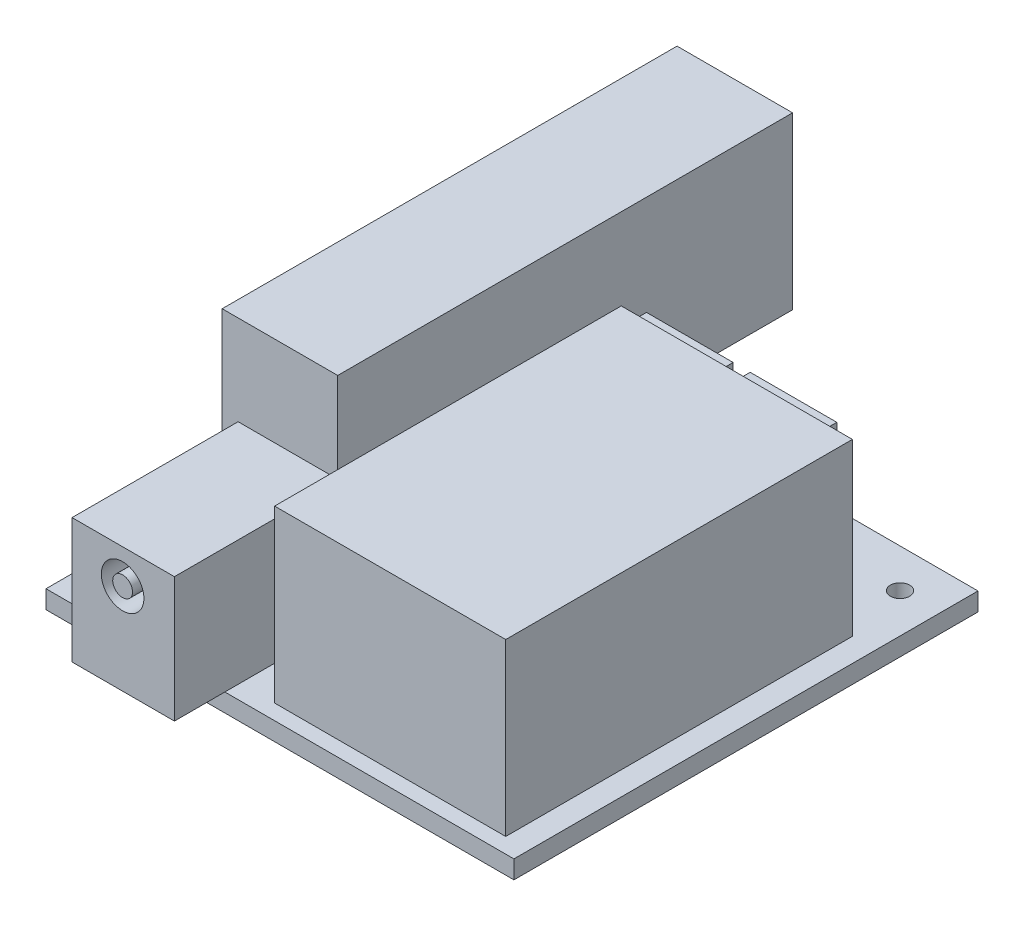
ISO-10303-21;
HEADER;
FILE_DESCRIPTION(('STEP AP214'),'2;1');
FILE_NAME('part.step','',(''),(''),'','','');
FILE_SCHEMA(('AUTOMOTIVE_DESIGN { 1 0 10303 214 1 1 1 1 }'));
ENDSEC;
DATA;
#1=APPLICATION_CONTEXT('core data for automotive mechanical design processes');
#2=APPLICATION_PROTOCOL_DEFINITION('international standard','automotive_design',2000,#1);
#3=PRODUCT_CONTEXT('',#1,'mechanical');
#4=PRODUCT('Part','Part','',(#3));
#5=PRODUCT_RELATED_PRODUCT_CATEGORY('part','',(#4));
#6=PRODUCT_DEFINITION_FORMATION('','',#4);
#7=PRODUCT_DEFINITION_CONTEXT('part definition',#1,'design');
#8=PRODUCT_DEFINITION('design','',#6,#7);
#9=PRODUCT_DEFINITION_SHAPE('','',#8);
#10=(LENGTH_UNIT() NAMED_UNIT(*) SI_UNIT(.MILLI.,.METRE.));
#11=(NAMED_UNIT(*) PLANE_ANGLE_UNIT() SI_UNIT($,.RADIAN.));
#12=(NAMED_UNIT(*) SI_UNIT($,.STERADIAN.) SOLID_ANGLE_UNIT());
#13=UNCERTAINTY_MEASURE_WITH_UNIT(LENGTH_MEASURE(1.E-05),#10,'distance_accuracy_value','');
#14=(GEOMETRIC_REPRESENTATION_CONTEXT(3) GLOBAL_UNCERTAINTY_ASSIGNED_CONTEXT((#13)) GLOBAL_UNIT_ASSIGNED_CONTEXT((#10,
#11,#12)) REPRESENTATION_CONTEXT('',''));
#15=CARTESIAN_POINT('',(0.,0.,0.));
#16=DIRECTION('',(0.,0.,1.));
#17=DIRECTION('',(1.,0.,0.));
#18=AXIS2_PLACEMENT_3D('',#15,#16,#17);
#19=CARTESIAN_POINT('',(0.,1.6,0.));
#20=DIRECTION('',(0.,-1.,0.));
#21=DIRECTION('',(0.,0.,-1.));
#22=AXIS2_PLACEMENT_3D('',#19,#20,#21);
#23=PLANE('',#22);
#24=DIRECTION('',(0.,0.,1.));
#25=VECTOR('',#24,1.);
#26=CARTESIAN_POINT('',(38.278,1.6,-38.545));
#27=LINE('',#26,#25);
#28=CARTESIAN_POINT('',(38.278,1.6,-38.545));
#29=VERTEX_POINT('',#28);
#30=CARTESIAN_POINT('',(38.278,1.6,-36.005));
#31=VERTEX_POINT('',#30);
#32=EDGE_CURVE('E333',#29,#31,#27,.T.);
#33=ORIENTED_EDGE('',*,*,#32,.F.);
#34=DIRECTION('',(-1.,0.,0.));
#35=VECTOR('',#34,1.);
#36=CARTESIAN_POINT('',(38.278,1.6,-38.545));
#37=LINE('',#36,#35);
#38=CARTESIAN_POINT('',(45.8988359062209,1.6,-38.545));
#39=VERTEX_POINT('',#38);
#40=EDGE_CURVE('E339',#39,#29,#37,.T.);
#41=ORIENTED_EDGE('',*,*,#40,.F.);
#42=DIRECTION('',(0.,0.,-1.));
#43=VECTOR('',#42,1.);
#44=CARTESIAN_POINT('',(45.8988359062209,1.6,-38.545));
#45=LINE('',#44,#43);
#46=CARTESIAN_POINT('',(45.8988359062209,1.6,-36.005));
#47=VERTEX_POINT('',#46);
#48=EDGE_CURVE('E354',#47,#39,#45,.T.);
#49=ORIENTED_EDGE('',*,*,#48,.F.);
#50=DIRECTION('',(1.,0.,0.));
#51=VECTOR('',#50,1.);
#52=CARTESIAN_POINT('',(38.278,1.6,-36.005));
#53=LINE('',#52,#51);
#54=EDGE_CURVE('E118',#31,#47,#53,.T.);
#55=ORIENTED_EDGE('',*,*,#54,.F.);
#56=EDGE_LOOP('',(#33,#41,#49,#55));
#57=FACE_BOUND('',#56,.T.);
#58=DIRECTION('',(0.,0.,1.));
#59=VECTOR('',#58,1.);
#60=CARTESIAN_POINT('',(33.558,1.6,-31.93));
#61=LINE('',#60,#59);
#62=CARTESIAN_POINT('',(33.558,1.6,-31.93));
#63=VERTEX_POINT('',#62);
#64=CARTESIAN_POINT('',(33.558,1.6,-1.44507918523153));
#65=VERTEX_POINT('',#64);
#66=EDGE_CURVE('E420',#63,#65,#61,.T.);
#67=ORIENTED_EDGE('',*,*,#66,.F.);
#68=DIRECTION('',(-1.,0.,0.));
#69=VECTOR('',#68,1.);
#70=CARTESIAN_POINT('',(33.558,1.6,-31.93));
#71=LINE('',#70,#69);
#72=CARTESIAN_POINT('',(53.8829208147685,1.6,-31.93));
#73=VERTEX_POINT('',#72);
#74=EDGE_CURVE('E426',#73,#63,#71,.T.);
#75=ORIENTED_EDGE('',*,*,#74,.F.);
#76=DIRECTION('',(0.,0.,-1.));
#77=VECTOR('',#76,1.);
#78=CARTESIAN_POINT('',(53.8829208147685,1.6,-31.93));
#79=LINE('',#78,#77);
#80=CARTESIAN_POINT('',(53.8829208147685,1.6,-1.44507918523153));
#81=VERTEX_POINT('',#80);
#82=EDGE_CURVE('E441',#81,#73,#79,.T.);
#83=ORIENTED_EDGE('',*,*,#82,.F.);
#84=DIRECTION('',(1.,0.,0.));
#85=VECTOR('',#84,1.);
#86=CARTESIAN_POINT('',(33.558,1.6,-1.44507918523153));
#87=LINE('',#86,#85);
#88=EDGE_CURVE('E438',#65,#81,#87,.T.);
#89=ORIENTED_EDGE('',*,*,#88,.F.);
#90=EDGE_LOOP('',(#67,#75,#83,#89));
#91=FACE_BOUND('',#90,.T.);
#92=CARTESIAN_POINT('',(52.5,1.6,-37.5));
#93=DIRECTION('',(0.,1.,0.));
#94=DIRECTION('',(0.,0.,1.));
#95=AXIS2_PLACEMENT_3D('',#92,#93,#94);
#96=CIRCLE('',#95,0.850799999999999);
#97=CARTESIAN_POINT('',(52.5,1.6,-36.6492));
#98=VERTEX_POINT('',#97);
#99=EDGE_CURVE('E508',#98,#98,#96,.T.);
#100=ORIENTED_EDGE('',*,*,#99,.F.);
#101=EDGE_LOOP('',(#100));
#102=FACE_BOUND('',#101,.T.);
#103=CARTESIAN_POINT('',(18.2,1.6,-3.5));
#104=DIRECTION('',(0.,1.,0.));
#105=DIRECTION('',(0.,0.,1.));
#106=AXIS2_PLACEMENT_3D('',#103,#104,#105);
#107=CIRCLE('',#106,0.8508);
#108=CARTESIAN_POINT('',(18.2,1.6,-2.6492));
#109=VERTEX_POINT('',#108);
#110=EDGE_CURVE('E520',#109,#109,#107,.T.);
#111=ORIENTED_EDGE('',*,*,#110,.F.);
#112=EDGE_LOOP('',(#111));
#113=FACE_BOUND('',#112,.T.);
#114=DIRECTION('',(0.,0.,1.));
#115=VECTOR('',#114,1.);
#116=CARTESIAN_POINT('',(29.158,1.6,-38.545));
#117=LINE('',#116,#115);
#118=CARTESIAN_POINT('',(29.158,1.6,-38.545));
#119=VERTEX_POINT('',#118);
#120=CARTESIAN_POINT('',(29.158,1.6,-36.005));
#121=VERTEX_POINT('',#120);
#122=EDGE_CURVE('E375',#119,#121,#117,.T.);
#123=ORIENTED_EDGE('',*,*,#122,.F.);
#124=DIRECTION('',(-1.,0.,0.));
#125=VECTOR('',#124,1.);
#126=CARTESIAN_POINT('',(29.158,1.6,-38.545));
#127=LINE('',#126,#125);
#128=CARTESIAN_POINT('',(36.7789853934151,1.6,-38.545));
#129=VERTEX_POINT('',#128);
#130=EDGE_CURVE('E381',#129,#119,#127,.T.);
#131=ORIENTED_EDGE('',*,*,#130,.F.);
#132=DIRECTION('',(0.,0.,-1.));
#133=VECTOR('',#132,1.);
#134=CARTESIAN_POINT('',(36.7789853934151,1.6,-38.545));
#135=LINE('',#134,#133);
#136=CARTESIAN_POINT('',(36.7789853934151,1.6,-36.005));
#137=VERTEX_POINT('',#136);
#138=EDGE_CURVE('E398',#137,#129,#135,.T.);
#139=ORIENTED_EDGE('',*,*,#138,.F.);
#140=DIRECTION('',(1.,0.,0.));
#141=VECTOR('',#140,1.);
#142=CARTESIAN_POINT('',(29.158,1.6,-36.005));
#143=LINE('',#142,#141);
#144=EDGE_CURVE('E394',#121,#137,#143,.T.);
#145=ORIENTED_EDGE('',*,*,#144,.F.);
#146=EDGE_LOOP('',(#123,#131,#139,#145));
#147=FACE_BOUND('',#146,.T.);
#148=DIRECTION('',(0.,0.,-1.));
#149=VECTOR('',#148,1.);
#150=CARTESIAN_POINT('',(26.383,1.6,-14.17));
#151=LINE('',#150,#149);
#152=CARTESIAN_POINT('',(26.383,1.6,-14.17));
#153=VERTEX_POINT('',#152);
#154=CARTESIAN_POINT('',(26.383,1.6,-40.91));
#155=VERTEX_POINT('',#154);
#156=EDGE_CURVE('E107',#153,#155,#151,.T.);
#157=ORIENTED_EDGE('',*,*,#156,.F.);
#158=DIRECTION('',(1.,0.,0.));
#159=VECTOR('',#158,1.);
#160=CARTESIAN_POINT('',(26.383,1.6,-14.17));
#161=LINE('',#160,#159);
#162=CARTESIAN_POINT('',(16.223,1.6,-14.17));
#163=VERTEX_POINT('',#162);
#164=EDGE_CURVE('E311',#163,#153,#161,.T.);
#165=ORIENTED_EDGE('',*,*,#164,.F.);
#166=DIRECTION('',(0.,0.,1.));
#167=VECTOR('',#166,1.);
#168=CARTESIAN_POINT('',(16.223,1.6,-14.17));
#169=LINE('',#168,#167);
#170=CARTESIAN_POINT('',(16.223,1.6,-40.91));
#171=VERTEX_POINT('',#170);
#172=EDGE_CURVE('E959',#171,#163,#169,.T.);
#173=ORIENTED_EDGE('',*,*,#172,.F.);
#174=DIRECTION('',(1.,0.,0.));
#175=VECTOR('',#174,1.);
#176=CARTESIAN_POINT('',(14.8,1.6,-40.91));
#177=LINE('',#176,#175);
#178=CARTESIAN_POINT('',(14.8,1.6,-40.91));
#179=VERTEX_POINT('',#178);
#180=EDGE_CURVE('E541',#179,#171,#177,.T.);
#181=ORIENTED_EDGE('',*,*,#180,.F.);
#182=DIRECTION('',(0.,0.,-1.));
#183=VECTOR('',#182,1.);
#184=CARTESIAN_POINT('',(14.8,1.6,-0.1));
#185=LINE('',#184,#183);
#186=CARTESIAN_POINT('',(14.8,1.6,-0.1));
#187=VERTEX_POINT('',#186);
#188=EDGE_CURVE('E535',#187,#179,#185,.T.);
#189=ORIENTED_EDGE('',*,*,#188,.F.);
#190=DIRECTION('',(-1.,0.,0.));
#191=VECTOR('',#190,1.);
#192=CARTESIAN_POINT('',(55.9481215124093,1.6,-0.100000000000005));
#193=LINE('',#192,#191);
#194=CARTESIAN_POINT('',(21.528,1.6,-0.100000000000001));
#195=VERTEX_POINT('',#194);
#196=EDGE_CURVE('E530',#195,#187,#193,.T.);
#197=ORIENTED_EDGE('',*,*,#196,.F.);
#198=DIRECTION('',(0.,0.,1.));
#199=VECTOR('',#198,1.);
#200=CARTESIAN_POINT('',(21.528,1.6,4.335));
#201=LINE('',#200,#199);
#202=CARTESIAN_POINT('',(21.528,1.6,-10.265));
#203=VERTEX_POINT('',#202);
#204=EDGE_CURVE('E487',#203,#195,#201,.T.);
#205=ORIENTED_EDGE('',*,*,#204,.F.);
#206=DIRECTION('',(-1.,0.,0.));
#207=VECTOR('',#206,1.);
#208=CARTESIAN_POINT('',(21.528,1.6,-10.265));
#209=LINE('',#208,#207);
#210=CARTESIAN_POINT('',(30.528,1.6,-10.265));
#211=VERTEX_POINT('',#210);
#212=EDGE_CURVE('E478',#211,#203,#209,.T.);
#213=ORIENTED_EDGE('',*,*,#212,.F.);
#214=DIRECTION('',(0.,0.,-1.));
#215=VECTOR('',#214,1.);
#216=CARTESIAN_POINT('',(30.528,1.6,-10.265));
#217=LINE('',#216,#215);
#218=CARTESIAN_POINT('',(30.528,1.6,-0.100000000000002));
#219=VERTEX_POINT('',#218);
#220=EDGE_CURVE('E12',#219,#211,#217,.T.);
#221=ORIENTED_EDGE('',*,*,#220,.F.);
#222=CARTESIAN_POINT('',(55.9481215124093,1.6,-0.100000000000005));
#223=VERTEX_POINT('',#222);
#224=EDGE_CURVE('E532',#223,#219,#193,.T.);
#225=ORIENTED_EDGE('',*,*,#224,.F.);
#226=DIRECTION('',(0.,0.,1.));
#227=VECTOR('',#226,1.);
#228=CARTESIAN_POINT('',(55.9481215124093,1.6,-40.91));
#229=LINE('',#228,#227);
#230=CARTESIAN_POINT('',(55.9481215124093,1.6,-40.91));
#231=VERTEX_POINT('',#230);
#232=EDGE_CURVE('E526',#231,#223,#229,.T.);
#233=ORIENTED_EDGE('',*,*,#232,.F.);
#234=EDGE_CURVE('E540',#155,#231,#177,.T.);
#235=ORIENTED_EDGE('',*,*,#234,.F.);
#236=EDGE_LOOP('',(#157,#165,#173,#181,#189,#197,#205,#213,#221,#225,#233,#235));
#237=FACE_BOUND('',#236,.T.);
#238=ADVANCED_FACE('F86',(#57,#91,#102,#113,#147,#237),#23,.F.);
#239=CARTESIAN_POINT('',(0.,0.,0.));
#240=DIRECTION('',(0.,-1.,0.));
#241=DIRECTION('',(0.,0.,-1.));
#242=AXIS2_PLACEMENT_3D('',#239,#240,#241);
#243=PLANE('',#242);
#244=CARTESIAN_POINT('',(18.2,0.,-37.5));
#245=DIRECTION('',(0.,1.,0.));
#246=DIRECTION('',(0.,0.,1.));
#247=AXIS2_PLACEMENT_3D('',#244,#245,#246);
#248=CIRCLE('',#247,0.850799999999999);
#249=CARTESIAN_POINT('',(18.2,0.,-36.6492));
#250=VERTEX_POINT('',#249);
#251=EDGE_CURVE('E512',#250,#250,#248,.T.);
#252=ORIENTED_EDGE('',*,*,#251,.T.);
#253=EDGE_LOOP('',(#252));
#254=FACE_BOUND('',#253,.T.);
#255=DIRECTION('',(0.,0.,1.));
#256=VECTOR('',#255,1.);
#257=CARTESIAN_POINT('',(55.9481215124093,0.,-40.91));
#258=LINE('',#257,#256);
#259=CARTESIAN_POINT('',(55.9481215124093,0.,-40.91));
#260=VERTEX_POINT('',#259);
#261=CARTESIAN_POINT('',(55.9481215124093,0.,-0.100000000000005));
#262=VERTEX_POINT('',#261);
#263=EDGE_CURVE('E523',#260,#262,#258,.T.);
#264=ORIENTED_EDGE('',*,*,#263,.T.);
#265=DIRECTION('',(-1.,0.,0.));
#266=VECTOR('',#265,1.);
#267=CARTESIAN_POINT('',(55.9481215124093,0.,-0.100000000000005));
#268=LINE('',#267,#266);
#269=CARTESIAN_POINT('',(14.8,0.,-0.1));
#270=VERTEX_POINT('',#269);
#271=EDGE_CURVE('E547',#262,#270,#268,.T.);
#272=ORIENTED_EDGE('',*,*,#271,.T.);
#273=DIRECTION('',(0.,0.,-1.));
#274=VECTOR('',#273,1.);
#275=CARTESIAN_POINT('',(14.8,0.,-0.1));
#276=LINE('',#275,#274);
#277=CARTESIAN_POINT('',(14.8,0.,-40.91));
#278=VERTEX_POINT('',#277);
#279=EDGE_CURVE('E550',#270,#278,#276,.T.);
#280=ORIENTED_EDGE('',*,*,#279,.T.);
#281=DIRECTION('',(1.,0.,0.));
#282=VECTOR('',#281,1.);
#283=CARTESIAN_POINT('',(14.8,0.,-40.91));
#284=LINE('',#283,#282);
#285=EDGE_CURVE('E531',#278,#260,#284,.T.);
#286=ORIENTED_EDGE('',*,*,#285,.T.);
#287=EDGE_LOOP('',(#264,#272,#280,#286));
#288=FACE_BOUND('',#287,.T.);
#289=CARTESIAN_POINT('',(18.2,0.,-3.5));
#290=DIRECTION('',(0.,1.,0.));
#291=DIRECTION('',(0.,0.,1.));
#292=AXIS2_PLACEMENT_3D('',#289,#290,#291);
#293=CIRCLE('',#292,0.8508);
#294=CARTESIAN_POINT('',(18.2,0.,-2.6492));
#295=VERTEX_POINT('',#294);
#296=EDGE_CURVE('E519',#295,#295,#293,.T.);
#297=ORIENTED_EDGE('',*,*,#296,.T.);
#298=EDGE_LOOP('',(#297));
#299=FACE_BOUND('',#298,.T.);
#300=CARTESIAN_POINT('',(52.5,0.,-37.5));
#301=DIRECTION('',(0.,1.,0.));
#302=DIRECTION('',(0.,0.,1.));
#303=AXIS2_PLACEMENT_3D('',#300,#301,#302);
#304=CIRCLE('',#303,0.850799999999999);
#305=CARTESIAN_POINT('',(52.5,0.,-36.6492));
#306=VERTEX_POINT('',#305);
#307=EDGE_CURVE('E507',#306,#306,#304,.T.);
#308=ORIENTED_EDGE('',*,*,#307,.T.);
#309=EDGE_LOOP('',(#308));
#310=FACE_BOUND('',#309,.T.);
#311=ADVANCED_FACE('F571',(#254,#288,#299,#310),#243,.T.);
#312=CARTESIAN_POINT('',(55.9481215124093,1.6,-40.91));
#313=DIRECTION('',(1.,0.,0.));
#314=DIRECTION('',(0.,0.,-1.));
#315=AXIS2_PLACEMENT_3D('',#312,#313,#314);
#316=PLANE('',#315);
#317=ORIENTED_EDGE('',*,*,#263,.F.);
#318=DIRECTION('',(0.,-1.,0.));
#319=VECTOR('',#318,1.);
#320=CARTESIAN_POINT('',(55.9481215124093,1.6,-40.91));
#321=LINE('',#320,#319);
#322=EDGE_CURVE('E95',#231,#260,#321,.T.);
#323=ORIENTED_EDGE('',*,*,#322,.F.);
#324=ORIENTED_EDGE('',*,*,#232,.T.);
#325=DIRECTION('',(0.,-1.,0.));
#326=VECTOR('',#325,1.);
#327=CARTESIAN_POINT('',(55.9481215124093,1.6,-0.100000000000005));
#328=LINE('',#327,#326);
#329=EDGE_CURVE('E90',#223,#262,#328,.T.);
#330=ORIENTED_EDGE('',*,*,#329,.T.);
#331=EDGE_LOOP('',(#317,#323,#324,#330));
#332=FACE_BOUND('',#331,.T.);
#333=ADVANCED_FACE('F88',(#332),#316,.T.);
#334=CARTESIAN_POINT('',(14.8,1.6,-40.91));
#335=DIRECTION('',(0.,0.,-1.));
#336=DIRECTION('',(-1.,0.,0.));
#337=AXIS2_PLACEMENT_3D('',#334,#335,#336);
#338=PLANE('',#337);
#339=ORIENTED_EDGE('',*,*,#285,.F.);
#340=DIRECTION('',(0.,-1.,0.));
#341=VECTOR('',#340,1.);
#342=CARTESIAN_POINT('',(14.8,1.6,-40.91));
#343=LINE('',#342,#341);
#344=EDGE_CURVE('E558',#179,#278,#343,.T.);
#345=ORIENTED_EDGE('',*,*,#344,.F.);
#346=ORIENTED_EDGE('',*,*,#180,.T.);
#347=DIRECTION('',(1.,0.,0.));
#348=VECTOR('',#347,1.);
#349=CARTESIAN_POINT('',(14.8,1.6,-40.91));
#350=LINE('',#349,#348);
#351=EDGE_CURVE('E323',#171,#155,#350,.T.);
#352=ORIENTED_EDGE('',*,*,#351,.T.);
#353=ORIENTED_EDGE('',*,*,#234,.T.);
#354=ORIENTED_EDGE('',*,*,#322,.T.);
#355=EDGE_LOOP('',(#339,#345,#346,#352,#353,#354));
#356=FACE_BOUND('',#355,.T.);
#357=ADVANCED_FACE('F575',(#356),#338,.T.);
#358=CARTESIAN_POINT('',(14.8,1.6,-0.1));
#359=DIRECTION('',(-1.,0.,0.));
#360=DIRECTION('',(0.,0.,1.));
#361=AXIS2_PLACEMENT_3D('',#358,#359,#360);
#362=PLANE('',#361);
#363=ORIENTED_EDGE('',*,*,#279,.F.);
#364=DIRECTION('',(0.,-1.,0.));
#365=VECTOR('',#364,1.);
#366=CARTESIAN_POINT('',(14.8,1.6,-0.1));
#367=LINE('',#366,#365);
#368=EDGE_CURVE('E559',#187,#270,#367,.T.);
#369=ORIENTED_EDGE('',*,*,#368,.F.);
#370=ORIENTED_EDGE('',*,*,#188,.T.);
#371=ORIENTED_EDGE('',*,*,#344,.T.);
#372=EDGE_LOOP('',(#363,#369,#370,#371));
#373=FACE_BOUND('',#372,.T.);
#374=ADVANCED_FACE('F629',(#373),#362,.T.);
#375=CARTESIAN_POINT('',(55.9481215124093,1.6,-0.100000000000005));
#376=DIRECTION('',(0.,0.,1.));
#377=DIRECTION('',(1.,0.,0.));
#378=AXIS2_PLACEMENT_3D('',#375,#376,#377);
#379=PLANE('',#378);
#380=ORIENTED_EDGE('',*,*,#271,.F.);
#381=ORIENTED_EDGE('',*,*,#329,.F.);
#382=ORIENTED_EDGE('',*,*,#224,.T.);
#383=EDGE_CURVE('E536',#219,#195,#193,.T.);
#384=ORIENTED_EDGE('',*,*,#383,.T.);
#385=ORIENTED_EDGE('',*,*,#196,.T.);
#386=ORIENTED_EDGE('',*,*,#368,.T.);
#387=EDGE_LOOP('',(#380,#381,#382,#384,#385,#386));
#388=FACE_BOUND('',#387,.T.);
#389=ADVANCED_FACE('F569',(#388),#379,.T.);
#390=CARTESIAN_POINT('',(18.2,1.6,-3.5));
#391=DIRECTION('',(0.,-1.,0.));
#392=DIRECTION('',(0.,0.,-1.));
#393=AXIS2_PLACEMENT_3D('',#390,#391,#392);
#394=CYLINDRICAL_SURFACE('',#393,0.8508);
#395=ORIENTED_EDGE('',*,*,#110,.T.);
#396=EDGE_LOOP('',(#395));
#397=FACE_BOUND('',#396,.T.);
#398=ORIENTED_EDGE('',*,*,#296,.F.);
#399=EDGE_LOOP('',(#398));
#400=FACE_BOUND('',#399,.T.);
#401=ADVANCED_FACE('F624',(#397,#400),#394,.F.);
#402=CARTESIAN_POINT('',(18.2,1.6,-37.5));
#403=DIRECTION('',(0.,-1.,0.));
#404=DIRECTION('',(0.,0.,-1.));
#405=AXIS2_PLACEMENT_3D('',#402,#403,#404);
#406=CYLINDRICAL_SURFACE('',#405,0.850799999999999);
#407=CARTESIAN_POINT('',(18.2,1.6,-37.5));
#408=DIRECTION('',(0.,1.,0.));
#409=DIRECTION('',(0.,0.,1.));
#410=AXIS2_PLACEMENT_3D('',#407,#408,#409);
#411=CIRCLE('',#410,0.850799999999999);
#412=CARTESIAN_POINT('',(18.2,1.6,-36.6492));
#413=VERTEX_POINT('',#412);
#414=EDGE_CURVE('E317',#413,#413,#411,.T.);
#415=ORIENTED_EDGE('',*,*,#414,.T.);
#416=EDGE_LOOP('',(#415));
#417=FACE_BOUND('',#416,.T.);
#418=ORIENTED_EDGE('',*,*,#251,.F.);
#419=EDGE_LOOP('',(#418));
#420=FACE_BOUND('',#419,.T.);
#421=ADVANCED_FACE('F636',(#417,#420),#406,.F.);
#422=CARTESIAN_POINT('',(52.5,1.6,-37.5));
#423=DIRECTION('',(0.,-1.,0.));
#424=DIRECTION('',(0.,0.,-1.));
#425=AXIS2_PLACEMENT_3D('',#422,#423,#424);
#426=CYLINDRICAL_SURFACE('',#425,0.850799999999999);
#427=ORIENTED_EDGE('',*,*,#99,.T.);
#428=EDGE_LOOP('',(#427));
#429=FACE_BOUND('',#428,.T.);
#430=ORIENTED_EDGE('',*,*,#307,.F.);
#431=EDGE_LOOP('',(#430));
#432=FACE_BOUND('',#431,.T.);
#433=ADVANCED_FACE('F641',(#429,#432),#426,.F.);
#434=CARTESIAN_POINT('',(0.,1.6,0.));
#435=DIRECTION('',(0.,-1.,0.));
#436=DIRECTION('',(0.,0.,-1.));
#437=AXIS2_PLACEMENT_3D('',#434,#435,#436);
#438=PLANE('',#437);
#439=ORIENTED_EDGE('',*,*,#383,.F.);
#440=CARTESIAN_POINT('',(30.528,1.6,4.335));
#441=VERTEX_POINT('',#440);
#442=EDGE_CURVE('E97',#441,#219,#217,.T.);
#443=ORIENTED_EDGE('',*,*,#442,.F.);
#444=DIRECTION('',(1.,0.,0.));
#445=VECTOR('',#444,1.);
#446=CARTESIAN_POINT('',(30.528,1.6,4.335));
#447=LINE('',#446,#445);
#448=CARTESIAN_POINT('',(21.528,1.6,4.335));
#449=VERTEX_POINT('',#448);
#450=EDGE_CURVE('E490',#449,#441,#447,.T.);
#451=ORIENTED_EDGE('',*,*,#450,.F.);
#452=EDGE_CURVE('E471',#195,#449,#201,.T.);
#453=ORIENTED_EDGE('',*,*,#452,.F.);
#454=EDGE_LOOP('',(#439,#443,#451,#453));
#455=FACE_BOUND('',#454,.T.);
#456=ADVANCED_FACE('F583',(#455),#438,.T.);
#457=CARTESIAN_POINT('',(21.528,12.6,4.335));
#458=DIRECTION('',(1.,0.,0.));
#459=DIRECTION('',(0.,0.,-1.));
#460=AXIS2_PLACEMENT_3D('',#457,#458,#459);
#461=PLANE('',#460);
#462=ORIENTED_EDGE('',*,*,#204,.T.);
#463=ORIENTED_EDGE('',*,*,#452,.T.);
#464=DIRECTION('',(0.,-1.,0.));
#465=VECTOR('',#464,1.);
#466=CARTESIAN_POINT('',(21.528,12.6,4.335));
#467=LINE('',#466,#465);
#468=CARTESIAN_POINT('',(21.528,12.6,4.335));
#469=VERTEX_POINT('',#468);
#470=EDGE_CURVE('E504',#469,#449,#467,.T.);
#471=ORIENTED_EDGE('',*,*,#470,.F.);
#472=DIRECTION('',(0.,0.,1.));
#473=VECTOR('',#472,1.);
#474=CARTESIAN_POINT('',(21.528,12.6,4.335));
#475=LINE('',#474,#473);
#476=CARTESIAN_POINT('',(21.528,12.6,-10.265));
#477=VERTEX_POINT('',#476);
#478=EDGE_CURVE('E474',#477,#469,#475,.T.);
#479=ORIENTED_EDGE('',*,*,#478,.F.);
#480=DIRECTION('',(0.,-1.,0.));
#481=VECTOR('',#480,1.);
#482=CARTESIAN_POINT('',(21.528,12.6,-10.265));
#483=LINE('',#482,#481);
#484=EDGE_CURVE('E486',#477,#203,#483,.T.);
#485=ORIENTED_EDGE('',*,*,#484,.T.);
#486=EDGE_LOOP('',(#462,#463,#471,#479,#485));
#487=FACE_BOUND('',#486,.T.);
#488=ADVANCED_FACE('F595',(#487),#461,.F.);
#489=CARTESIAN_POINT('',(30.528,12.6,4.335));
#490=DIRECTION('',(0.,0.,-1.));
#491=DIRECTION('',(-1.,0.,0.));
#492=AXIS2_PLACEMENT_3D('',#489,#490,#491);
#493=PLANE('',#492);
#494=CARTESIAN_POINT('',(25.9726135105656,9.59308139167432,4.335));
#495=DIRECTION('',(0.,0.,1.));
#496=DIRECTION('',(1.,0.,0.));
#497=AXIS2_PLACEMENT_3D('',#494,#495,#496);
#498=CIRCLE('',#497,1.8713578294989);
#499=CARTESIAN_POINT('',(27.8439713400645,9.59308139167432,4.335));
#500=VERTEX_POINT('',#499);
#501=EDGE_CURVE('E465',#500,#500,#498,.T.);
#502=ORIENTED_EDGE('',*,*,#501,.F.);
#503=EDGE_LOOP('',(#502));
#504=FACE_BOUND('',#503,.T.);
#505=ORIENTED_EDGE('',*,*,#450,.T.);
#506=DIRECTION('',(0.,-1.,0.));
#507=VECTOR('',#506,1.);
#508=CARTESIAN_POINT('',(30.528,12.6,4.335));
#509=LINE('',#508,#507);
#510=CARTESIAN_POINT('',(30.528,12.6,4.335));
#511=VERTEX_POINT('',#510);
#512=EDGE_CURVE('E501',#511,#441,#509,.T.);
#513=ORIENTED_EDGE('',*,*,#512,.F.);
#514=DIRECTION('',(1.,0.,0.));
#515=VECTOR('',#514,1.);
#516=CARTESIAN_POINT('',(30.528,12.6,4.335));
#517=LINE('',#516,#515);
#518=EDGE_CURVE('E477',#469,#511,#517,.T.);
#519=ORIENTED_EDGE('',*,*,#518,.F.);
#520=ORIENTED_EDGE('',*,*,#470,.T.);
#521=EDGE_LOOP('',(#505,#513,#519,#520));
#522=FACE_BOUND('',#521,.T.);
#523=ADVANCED_FACE('F591',(#504,#522),#493,.F.);
#524=CARTESIAN_POINT('',(30.528,12.6,-10.265));
#525=DIRECTION('',(-1.,0.,0.));
#526=DIRECTION('',(0.,0.,1.));
#527=AXIS2_PLACEMENT_3D('',#524,#525,#526);
#528=PLANE('',#527);
#529=ORIENTED_EDGE('',*,*,#442,.T.);
#530=ORIENTED_EDGE('',*,*,#220,.T.);
#531=DIRECTION('',(0.,-1.,0.));
#532=VECTOR('',#531,1.);
#533=CARTESIAN_POINT('',(30.528,12.6,-10.265));
#534=LINE('',#533,#532);
#535=CARTESIAN_POINT('',(30.528,12.6,-10.265));
#536=VERTEX_POINT('',#535);
#537=EDGE_CURVE('E497',#536,#211,#534,.T.);
#538=ORIENTED_EDGE('',*,*,#537,.F.);
#539=DIRECTION('',(0.,0.,-1.));
#540=VECTOR('',#539,1.);
#541=CARTESIAN_POINT('',(30.528,12.6,-10.265));
#542=LINE('',#541,#540);
#543=EDGE_CURVE('E480',#511,#536,#542,.T.);
#544=ORIENTED_EDGE('',*,*,#543,.F.);
#545=ORIENTED_EDGE('',*,*,#512,.T.);
#546=EDGE_LOOP('',(#529,#530,#538,#544,#545));
#547=FACE_BOUND('',#546,.T.);
#548=ADVANCED_FACE('F586',(#547),#528,.F.);
#549=CARTESIAN_POINT('',(21.528,12.6,-10.265));
#550=DIRECTION('',(0.,0.,1.));
#551=DIRECTION('',(1.,0.,0.));
#552=AXIS2_PLACEMENT_3D('',#549,#550,#551);
#553=PLANE('',#552);
#554=ORIENTED_EDGE('',*,*,#212,.T.);
#555=ORIENTED_EDGE('',*,*,#484,.F.);
#556=DIRECTION('',(-1.,0.,0.));
#557=VECTOR('',#556,1.);
#558=CARTESIAN_POINT('',(21.528,12.6,-10.265));
#559=LINE('',#558,#557);
#560=EDGE_CURVE('E483',#536,#477,#559,.T.);
#561=ORIENTED_EDGE('',*,*,#560,.F.);
#562=ORIENTED_EDGE('',*,*,#537,.T.);
#563=EDGE_LOOP('',(#554,#555,#561,#562));
#564=FACE_BOUND('',#563,.T.);
#565=ADVANCED_FACE('F599',(#564),#553,.F.);
#566=CARTESIAN_POINT('',(0.,12.6,0.));
#567=DIRECTION('',(0.,-1.,0.));
#568=DIRECTION('',(0.,0.,-1.));
#569=AXIS2_PLACEMENT_3D('',#566,#567,#568);
#570=PLANE('',#569);
#571=ORIENTED_EDGE('',*,*,#478,.T.);
#572=ORIENTED_EDGE('',*,*,#518,.T.);
#573=ORIENTED_EDGE('',*,*,#543,.T.);
#574=ORIENTED_EDGE('',*,*,#560,.T.);
#575=EDGE_LOOP('',(#571,#572,#573,#574));
#576=FACE_BOUND('',#575,.T.);
#577=ADVANCED_FACE('F602',(#576),#570,.F.);
#578=CARTESIAN_POINT('',(25.9726135105656,9.59308139167432,-6.665));
#579=DIRECTION('',(0.,0.,1.));
#580=DIRECTION('',(1.,0.,0.));
#581=AXIS2_PLACEMENT_3D('',#578,#579,#580);
#582=CYLINDRICAL_SURFACE('',#581,1.8713578294989);
#583=CARTESIAN_POINT('',(25.9726135105656,9.59308139167432,-6.665));
#584=DIRECTION('',(0.,0.,1.));
#585=DIRECTION('',(1.,0.,0.));
#586=AXIS2_PLACEMENT_3D('',#583,#584,#585);
#587=CIRCLE('',#586,1.8713578294989);
#588=CARTESIAN_POINT('',(27.8439713400645,9.59308139167432,-6.665));
#589=VERTEX_POINT('',#588);
#590=EDGE_CURVE('E468',#589,#589,#587,.T.);
#591=ORIENTED_EDGE('',*,*,#590,.F.);
#592=EDGE_LOOP('',(#591));
#593=FACE_BOUND('',#592,.T.);
#594=ORIENTED_EDGE('',*,*,#501,.T.);
#595=EDGE_LOOP('',(#594));
#596=FACE_BOUND('',#595,.T.);
#597=ADVANCED_FACE('F604',(#593,#596),#582,.F.);
#598=CARTESIAN_POINT('',(25.9726135105656,9.59308139167432,-6.665));
#599=DIRECTION('',(0.,0.,1.));
#600=DIRECTION('',(1.,0.,0.));
#601=AXIS2_PLACEMENT_3D('',#598,#599,#600);
#602=PLANE('',#601);
#603=CARTESIAN_POINT('',(25.9726135105656,9.59308139167432,-6.665));
#604=DIRECTION('',(0.,0.,1.));
#605=DIRECTION('',(1.,0.,0.));
#606=AXIS2_PLACEMENT_3D('',#603,#604,#605);
#607=CIRCLE('',#606,0.869870556291287);
#608=CARTESIAN_POINT('',(26.8424840668569,9.59308139167432,-6.665));
#609=VERTEX_POINT('',#608);
#610=EDGE_CURVE('E462',#609,#609,#607,.T.);
#611=ORIENTED_EDGE('',*,*,#610,.F.);
#612=EDGE_LOOP('',(#611));
#613=FACE_BOUND('',#612,.T.);
#614=ORIENTED_EDGE('',*,*,#590,.T.);
#615=EDGE_LOOP('',(#614));
#616=FACE_BOUND('',#615,.T.);
#617=ADVANCED_FACE('F610',(#613,#616),#602,.T.);
#618=CARTESIAN_POINT('',(25.9726135105656,9.59308139167432,-6.665));
#619=DIRECTION('',(0.,0.,1.));
#620=DIRECTION('',(1.,0.,0.));
#621=AXIS2_PLACEMENT_3D('',#618,#619,#620);
#622=CYLINDRICAL_SURFACE('',#621,0.869870556291287);
#623=ORIENTED_EDGE('',*,*,#610,.T.);
#624=EDGE_LOOP('',(#623));
#625=FACE_BOUND('',#624,.T.);
#626=CARTESIAN_POINT('',(25.9726135105656,9.59308139167432,4.335));
#627=DIRECTION('',(0.,0.,1.));
#628=DIRECTION('',(1.,0.,0.));
#629=AXIS2_PLACEMENT_3D('',#626,#627,#628);
#630=CIRCLE('',#629,0.869870556291287);
#631=CARTESIAN_POINT('',(26.8424840668569,9.59308139167432,4.335));
#632=VERTEX_POINT('',#631);
#633=EDGE_CURVE('E461',#632,#632,#630,.T.);
#634=ORIENTED_EDGE('',*,*,#633,.F.);
#635=EDGE_LOOP('',(#634));
#636=FACE_BOUND('',#635,.T.);
#637=ADVANCED_FACE('F697',(#625,#636),#622,.T.);
#638=ORIENTED_EDGE('',*,*,#633,.T.);
#639=EDGE_LOOP('',(#638));
#640=FACE_BOUND('',#639,.T.);
#641=ADVANCED_FACE('F661',(#640),#493,.F.);
#642=CARTESIAN_POINT('',(33.558,16.6,-31.93));
#643=DIRECTION('',(1.,0.,0.));
#644=DIRECTION('',(0.,0.,-1.));
#645=AXIS2_PLACEMENT_3D('',#642,#643,#644);
#646=PLANE('',#645);
#647=ORIENTED_EDGE('',*,*,#66,.T.);
#648=DIRECTION('',(0.,-1.,0.));
#649=VECTOR('',#648,1.);
#650=CARTESIAN_POINT('',(33.558,16.6,-1.44507918523153));
#651=LINE('',#650,#649);
#652=CARTESIAN_POINT('',(33.558,16.6,-1.44507918523153));
#653=VERTEX_POINT('',#652);
#654=EDGE_CURVE('E458',#653,#65,#651,.T.);
#655=ORIENTED_EDGE('',*,*,#654,.F.);
#656=DIRECTION('',(0.,0.,1.));
#657=VECTOR('',#656,1.);
#658=CARTESIAN_POINT('',(33.558,16.6,-31.93));
#659=LINE('',#658,#657);
#660=CARTESIAN_POINT('',(33.558,16.6,-31.93));
#661=VERTEX_POINT('',#660);
#662=EDGE_CURVE('E421',#661,#653,#659,.T.);
#663=ORIENTED_EDGE('',*,*,#662,.F.);
#664=DIRECTION('',(0.,-1.,0.));
#665=VECTOR('',#664,1.);
#666=CARTESIAN_POINT('',(33.558,16.6,-31.93));
#667=LINE('',#666,#665);
#668=EDGE_CURVE('E434',#661,#63,#667,.T.);
#669=ORIENTED_EDGE('',*,*,#668,.T.);
#670=EDGE_LOOP('',(#647,#655,#663,#669));
#671=FACE_BOUND('',#670,.T.);
#672=ADVANCED_FACE('F716',(#671),#646,.F.);
#673=CARTESIAN_POINT('',(33.558,16.6,-1.44507918523153));
#674=DIRECTION('',(0.,0.,-1.));
#675=DIRECTION('',(-1.,0.,0.));
#676=AXIS2_PLACEMENT_3D('',#673,#674,#675);
#677=PLANE('',#676);
#678=ORIENTED_EDGE('',*,*,#88,.T.);
#679=DIRECTION('',(0.,-1.,0.));
#680=VECTOR('',#679,1.);
#681=CARTESIAN_POINT('',(53.8829208147685,16.6,-1.44507918523153));
#682=LINE('',#681,#680);
#683=CARTESIAN_POINT('',(53.8829208147685,16.6,-1.44507918523153));
#684=VERTEX_POINT('',#683);
#685=EDGE_CURVE('E455',#684,#81,#682,.T.);
#686=ORIENTED_EDGE('',*,*,#685,.F.);
#687=DIRECTION('',(1.,0.,0.));
#688=VECTOR('',#687,1.);
#689=CARTESIAN_POINT('',(33.558,16.6,-1.44507918523153));
#690=LINE('',#689,#688);
#691=EDGE_CURVE('E425',#653,#684,#690,.T.);
#692=ORIENTED_EDGE('',*,*,#691,.F.);
#693=ORIENTED_EDGE('',*,*,#654,.T.);
#694=EDGE_LOOP('',(#678,#686,#692,#693));
#695=FACE_BOUND('',#694,.T.);
#696=ADVANCED_FACE('F724',(#695),#677,.F.);
#697=CARTESIAN_POINT('',(53.8829208147685,16.6,-31.93));
#698=DIRECTION('',(-1.,0.,0.));
#699=DIRECTION('',(0.,0.,1.));
#700=AXIS2_PLACEMENT_3D('',#697,#698,#699);
#701=PLANE('',#700);
#702=ORIENTED_EDGE('',*,*,#82,.T.);
#703=DIRECTION('',(0.,-1.,0.));
#704=VECTOR('',#703,1.);
#705=CARTESIAN_POINT('',(53.8829208147685,16.6,-31.93));
#706=LINE('',#705,#704);
#707=CARTESIAN_POINT('',(53.8829208147685,16.6,-31.93));
#708=VERTEX_POINT('',#707);
#709=EDGE_CURVE('E451',#708,#73,#706,.T.);
#710=ORIENTED_EDGE('',*,*,#709,.F.);
#711=DIRECTION('',(0.,0.,-1.));
#712=VECTOR('',#711,1.);
#713=CARTESIAN_POINT('',(53.8829208147685,16.6,-31.93));
#714=LINE('',#713,#712);
#715=EDGE_CURVE('E428',#684,#708,#714,.T.);
#716=ORIENTED_EDGE('',*,*,#715,.F.);
#717=ORIENTED_EDGE('',*,*,#685,.T.);
#718=EDGE_LOOP('',(#702,#710,#716,#717));
#719=FACE_BOUND('',#718,.T.);
#720=ADVANCED_FACE('F735',(#719),#701,.F.);
#721=CARTESIAN_POINT('',(33.558,16.6,-31.93));
#722=DIRECTION('',(0.,0.,1.));
#723=DIRECTION('',(1.,0.,0.));
#724=AXIS2_PLACEMENT_3D('',#721,#722,#723);
#725=PLANE('',#724);
#726=ORIENTED_EDGE('',*,*,#74,.T.);
#727=ORIENTED_EDGE('',*,*,#668,.F.);
#728=DIRECTION('',(-1.,0.,0.));
#729=VECTOR('',#728,1.);
#730=CARTESIAN_POINT('',(33.558,16.6,-31.93));
#731=LINE('',#730,#729);
#732=EDGE_CURVE('E431',#708,#661,#731,.T.);
#733=ORIENTED_EDGE('',*,*,#732,.F.);
#734=ORIENTED_EDGE('',*,*,#709,.T.);
#735=EDGE_LOOP('',(#726,#727,#733,#734));
#736=FACE_BOUND('',#735,.T.);
#737=ADVANCED_FACE('F745',(#736),#725,.F.);
#738=CARTESIAN_POINT('',(0.,16.6,0.));
#739=DIRECTION('',(0.,1.,0.));
#740=DIRECTION('',(0.,0.,1.));
#741=AXIS2_PLACEMENT_3D('',#738,#739,#740);
#742=PLANE('',#741);
#743=ORIENTED_EDGE('',*,*,#662,.T.);
#744=ORIENTED_EDGE('',*,*,#691,.T.);
#745=ORIENTED_EDGE('',*,*,#715,.T.);
#746=ORIENTED_EDGE('',*,*,#732,.T.);
#747=EDGE_LOOP('',(#743,#744,#745,#746));
#748=FACE_BOUND('',#747,.T.);
#749=ADVANCED_FACE('F756',(#748),#742,.T.);
#750=CARTESIAN_POINT('',(29.158,10.6,-38.545));
#751=DIRECTION('',(1.,0.,0.));
#752=DIRECTION('',(0.,0.,-1.));
#753=AXIS2_PLACEMENT_3D('',#750,#751,#752);
#754=PLANE('',#753);
#755=ORIENTED_EDGE('',*,*,#122,.T.);
#756=DIRECTION('',(0.,-1.,0.));
#757=VECTOR('',#756,1.);
#758=CARTESIAN_POINT('',(29.158,10.6,-36.005));
#759=LINE('',#758,#757);
#760=CARTESIAN_POINT('',(29.158,10.6,-36.005));
#761=VERTEX_POINT('',#760);
#762=EDGE_CURVE('E416',#761,#121,#759,.T.);
#763=ORIENTED_EDGE('',*,*,#762,.F.);
#764=DIRECTION('',(0.,0.,1.));
#765=VECTOR('',#764,1.);
#766=CARTESIAN_POINT('',(29.158,10.6,-38.545));
#767=LINE('',#766,#765);
#768=CARTESIAN_POINT('',(29.158,10.6,-38.545));
#769=VERTEX_POINT('',#768);
#770=EDGE_CURVE('E376',#769,#761,#767,.T.);
#771=ORIENTED_EDGE('',*,*,#770,.F.);
#772=DIRECTION('',(0.,-1.,0.));
#773=VECTOR('',#772,1.);
#774=CARTESIAN_POINT('',(29.158,10.6,-38.545));
#775=LINE('',#774,#773);
#776=EDGE_CURVE('E390',#769,#119,#775,.T.);
#777=ORIENTED_EDGE('',*,*,#776,.T.);
#778=EDGE_LOOP('',(#755,#763,#771,#777));
#779=FACE_BOUND('',#778,.T.);
#780=ADVANCED_FACE('F767',(#779),#754,.F.);
#781=CARTESIAN_POINT('',(29.158,10.6,-36.005));
#782=DIRECTION('',(0.,0.,-1.));
#783=DIRECTION('',(-1.,0.,0.));
#784=AXIS2_PLACEMENT_3D('',#781,#782,#783);
#785=PLANE('',#784);
#786=ORIENTED_EDGE('',*,*,#144,.T.);
#787=DIRECTION('',(0.,-1.,0.));
#788=VECTOR('',#787,1.);
#789=CARTESIAN_POINT('',(36.7789853934151,10.6,-36.005));
#790=LINE('',#789,#788);
#791=CARTESIAN_POINT('',(36.7789853934151,10.6,-36.005));
#792=VERTEX_POINT('',#791);
#793=EDGE_CURVE('E412',#792,#137,#790,.T.);
#794=ORIENTED_EDGE('',*,*,#793,.F.);
#795=DIRECTION('',(1.,0.,0.));
#796=VECTOR('',#795,1.);
#797=CARTESIAN_POINT('',(29.158,10.6,-36.005));
#798=LINE('',#797,#796);
#799=EDGE_CURVE('E380',#761,#792,#798,.T.);
#800=ORIENTED_EDGE('',*,*,#799,.F.);
#801=ORIENTED_EDGE('',*,*,#762,.T.);
#802=EDGE_LOOP('',(#786,#794,#800,#801));
#803=FACE_BOUND('',#802,.T.);
#804=ADVANCED_FACE('F777',(#803),#785,.F.);
#805=CARTESIAN_POINT('',(36.7789853934151,10.6,-38.545));
#806=DIRECTION('',(-1.,0.,0.));
#807=DIRECTION('',(0.,0.,1.));
#808=AXIS2_PLACEMENT_3D('',#805,#806,#807);
#809=PLANE('',#808);
#810=ORIENTED_EDGE('',*,*,#138,.T.);
#811=DIRECTION('',(0.,-1.,0.));
#812=VECTOR('',#811,1.);
#813=CARTESIAN_POINT('',(36.7789853934151,10.6,-38.545));
#814=LINE('',#813,#812);
#815=CARTESIAN_POINT('',(36.7789853934151,10.6,-38.545));
#816=VERTEX_POINT('',#815);
#817=EDGE_CURVE('E408',#816,#129,#814,.T.);
#818=ORIENTED_EDGE('',*,*,#817,.F.);
#819=DIRECTION('',(0.,0.,-1.));
#820=VECTOR('',#819,1.);
#821=CARTESIAN_POINT('',(36.7789853934151,10.6,-38.545));
#822=LINE('',#821,#820);
#823=EDGE_CURVE('E384',#792,#816,#822,.T.);
#824=ORIENTED_EDGE('',*,*,#823,.F.);
#825=ORIENTED_EDGE('',*,*,#793,.T.);
#826=EDGE_LOOP('',(#810,#818,#824,#825));
#827=FACE_BOUND('',#826,.T.);
#828=ADVANCED_FACE('F788',(#827),#809,.F.);
#829=CARTESIAN_POINT('',(29.158,10.6,-38.545));
#830=DIRECTION('',(0.,0.,1.));
#831=DIRECTION('',(1.,0.,0.));
#832=AXIS2_PLACEMENT_3D('',#829,#830,#831);
#833=PLANE('',#832);
#834=ORIENTED_EDGE('',*,*,#130,.T.);
#835=ORIENTED_EDGE('',*,*,#776,.F.);
#836=DIRECTION('',(-1.,0.,0.));
#837=VECTOR('',#836,1.);
#838=CARTESIAN_POINT('',(29.158,10.6,-38.545));
#839=LINE('',#838,#837);
#840=EDGE_CURVE('E387',#816,#769,#839,.T.);
#841=ORIENTED_EDGE('',*,*,#840,.F.);
#842=ORIENTED_EDGE('',*,*,#817,.T.);
#843=EDGE_LOOP('',(#834,#835,#841,#842));
#844=FACE_BOUND('',#843,.T.);
#845=ADVANCED_FACE('F798',(#844),#833,.F.);
#846=CARTESIAN_POINT('',(0.,10.6,0.));
#847=DIRECTION('',(0.,1.,0.));
#848=DIRECTION('',(0.,0.,1.));
#849=AXIS2_PLACEMENT_3D('',#846,#847,#848);
#850=PLANE('',#849);
#851=ORIENTED_EDGE('',*,*,#770,.T.);
#852=ORIENTED_EDGE('',*,*,#799,.T.);
#853=ORIENTED_EDGE('',*,*,#823,.T.);
#854=ORIENTED_EDGE('',*,*,#840,.T.);
#855=EDGE_LOOP('',(#851,#852,#853,#854));
#856=FACE_BOUND('',#855,.T.);
#857=ADVANCED_FACE('F808',(#856),#850,.T.);
#858=CARTESIAN_POINT('',(38.278,10.6,-38.545));
#859=DIRECTION('',(1.,0.,0.));
#860=DIRECTION('',(0.,0.,-1.));
#861=AXIS2_PLACEMENT_3D('',#858,#859,#860);
#862=PLANE('',#861);
#863=ORIENTED_EDGE('',*,*,#32,.T.);
#864=DIRECTION('',(0.,-1.,0.));
#865=VECTOR('',#864,1.);
#866=CARTESIAN_POINT('',(38.278,10.6,-36.005));
#867=LINE('',#866,#865);
#868=CARTESIAN_POINT('',(38.278,10.6,-36.005));
#869=VERTEX_POINT('',#868);
#870=EDGE_CURVE('E372',#869,#31,#867,.T.);
#871=ORIENTED_EDGE('',*,*,#870,.F.);
#872=DIRECTION('',(0.,0.,1.));
#873=VECTOR('',#872,1.);
#874=CARTESIAN_POINT('',(38.278,10.6,-38.545));
#875=LINE('',#874,#873);
#876=CARTESIAN_POINT('',(38.278,10.6,-38.545));
#877=VERTEX_POINT('',#876);
#878=EDGE_CURVE('E334',#877,#869,#875,.T.);
#879=ORIENTED_EDGE('',*,*,#878,.F.);
#880=DIRECTION('',(0.,-1.,0.));
#881=VECTOR('',#880,1.);
#882=CARTESIAN_POINT('',(38.278,10.6,-38.545));
#883=LINE('',#882,#881);
#884=EDGE_CURVE('E348',#877,#29,#883,.T.);
#885=ORIENTED_EDGE('',*,*,#884,.T.);
#886=EDGE_LOOP('',(#863,#871,#879,#885));
#887=FACE_BOUND('',#886,.T.);
#888=ADVANCED_FACE('F818',(#887),#862,.F.);
#889=CARTESIAN_POINT('',(38.278,10.6,-36.005));
#890=DIRECTION('',(0.,0.,-1.));
#891=DIRECTION('',(-1.,0.,0.));
#892=AXIS2_PLACEMENT_3D('',#889,#890,#891);
#893=PLANE('',#892);
#894=ORIENTED_EDGE('',*,*,#54,.T.);
#895=DIRECTION('',(0.,-1.,0.));
#896=VECTOR('',#895,1.);
#897=CARTESIAN_POINT('',(45.8988359062209,10.6,-36.005));
#898=LINE('',#897,#896);
#899=CARTESIAN_POINT('',(45.8988359062209,10.6,-36.005));
#900=VERTEX_POINT('',#899);
#901=EDGE_CURVE('E368',#900,#47,#898,.T.);
#902=ORIENTED_EDGE('',*,*,#901,.F.);
#903=DIRECTION('',(1.,0.,0.));
#904=VECTOR('',#903,1.);
#905=CARTESIAN_POINT('',(38.278,10.6,-36.005));
#906=LINE('',#905,#904);
#907=EDGE_CURVE('E338',#869,#900,#906,.T.);
#908=ORIENTED_EDGE('',*,*,#907,.F.);
#909=ORIENTED_EDGE('',*,*,#870,.T.);
#910=EDGE_LOOP('',(#894,#902,#908,#909));
#911=FACE_BOUND('',#910,.T.);
#912=ADVANCED_FACE('F828',(#911),#893,.F.);
#913=CARTESIAN_POINT('',(45.8988359062209,10.6,-38.545));
#914=DIRECTION('',(-1.,0.,0.));
#915=DIRECTION('',(0.,0.,1.));
#916=AXIS2_PLACEMENT_3D('',#913,#914,#915);
#917=PLANE('',#916);
#918=ORIENTED_EDGE('',*,*,#48,.T.);
#919=DIRECTION('',(0.,-1.,0.));
#920=VECTOR('',#919,1.);
#921=CARTESIAN_POINT('',(45.8988359062209,10.6,-38.545));
#922=LINE('',#921,#920);
#923=CARTESIAN_POINT('',(45.8988359062209,10.6,-38.545));
#924=VERTEX_POINT('',#923);
#925=EDGE_CURVE('E364',#924,#39,#922,.T.);
#926=ORIENTED_EDGE('',*,*,#925,.F.);
#927=DIRECTION('',(0.,0.,-1.));
#928=VECTOR('',#927,1.);
#929=CARTESIAN_POINT('',(45.8988359062209,10.6,-38.545));
#930=LINE('',#929,#928);
#931=EDGE_CURVE('E342',#900,#924,#930,.T.);
#932=ORIENTED_EDGE('',*,*,#931,.F.);
#933=ORIENTED_EDGE('',*,*,#901,.T.);
#934=EDGE_LOOP('',(#918,#926,#932,#933));
#935=FACE_BOUND('',#934,.T.);
#936=ADVANCED_FACE('F838',(#935),#917,.F.);
#937=CARTESIAN_POINT('',(38.278,10.6,-38.545));
#938=DIRECTION('',(0.,0.,1.));
#939=DIRECTION('',(1.,0.,0.));
#940=AXIS2_PLACEMENT_3D('',#937,#938,#939);
#941=PLANE('',#940);
#942=ORIENTED_EDGE('',*,*,#40,.T.);
#943=ORIENTED_EDGE('',*,*,#884,.F.);
#944=DIRECTION('',(-1.,0.,0.));
#945=VECTOR('',#944,1.);
#946=CARTESIAN_POINT('',(38.278,10.6,-38.545));
#947=LINE('',#946,#945);
#948=EDGE_CURVE('E345',#924,#877,#947,.T.);
#949=ORIENTED_EDGE('',*,*,#948,.F.);
#950=ORIENTED_EDGE('',*,*,#925,.T.);
#951=EDGE_LOOP('',(#942,#943,#949,#950));
#952=FACE_BOUND('',#951,.T.);
#953=ADVANCED_FACE('F847',(#952),#941,.F.);
#954=CARTESIAN_POINT('',(0.,10.6,0.));
#955=DIRECTION('',(0.,1.,0.));
#956=DIRECTION('',(0.,0.,1.));
#957=AXIS2_PLACEMENT_3D('',#954,#955,#956);
#958=PLANE('',#957);
#959=ORIENTED_EDGE('',*,*,#878,.T.);
#960=ORIENTED_EDGE('',*,*,#907,.T.);
#961=ORIENTED_EDGE('',*,*,#931,.T.);
#962=ORIENTED_EDGE('',*,*,#948,.T.);
#963=EDGE_LOOP('',(#959,#960,#961,#962));
#964=FACE_BOUND('',#963,.T.);
#965=ADVANCED_FACE('F857',(#964),#958,.T.);
#966=CARTESIAN_POINT('',(0.,1.6,0.));
#967=DIRECTION('',(0.,1.,0.));
#968=DIRECTION('',(0.,0.,1.));
#969=AXIS2_PLACEMENT_3D('',#966,#967,#968);
#970=PLANE('',#969);
#971=ORIENTED_EDGE('',*,*,#414,.F.);
#972=EDGE_LOOP('',(#971));
#973=FACE_BOUND('',#972,.T.);
#974=ADVANCED_FACE('F867',(#973),#970,.F.);
#975=ORIENTED_EDGE('',*,*,#351,.F.);
#976=CARTESIAN_POINT('',(16.223,1.6,-54.17));
#977=VERTEX_POINT('',#976);
#978=EDGE_CURVE('E952',#977,#171,#169,.T.);
#979=ORIENTED_EDGE('',*,*,#978,.F.);
#980=DIRECTION('',(-1.,0.,0.));
#981=VECTOR('',#980,1.);
#982=CARTESIAN_POINT('',(26.383,1.6,-54.17));
#983=LINE('',#982,#981);
#984=CARTESIAN_POINT('',(26.383,1.6,-54.17));
#985=VERTEX_POINT('',#984);
#986=EDGE_CURVE('E957',#985,#977,#983,.T.);
#987=ORIENTED_EDGE('',*,*,#986,.F.);
#988=EDGE_CURVE('E314',#155,#985,#151,.T.);
#989=ORIENTED_EDGE('',*,*,#988,.F.);
#990=EDGE_LOOP('',(#975,#979,#987,#989));
#991=FACE_BOUND('',#990,.T.);
#992=ADVANCED_FACE('F891',(#991),#970,.F.);
#993=CARTESIAN_POINT('',(26.383,16.6,-14.17));
#994=DIRECTION('',(-1.,0.,0.));
#995=DIRECTION('',(0.,0.,1.));
#996=AXIS2_PLACEMENT_3D('',#993,#994,#995);
#997=PLANE('',#996);
#998=ORIENTED_EDGE('',*,*,#156,.T.);
#999=ORIENTED_EDGE('',*,*,#988,.T.);
#1000=DIRECTION('',(0.,-1.,0.));
#1001=VECTOR('',#1000,1.);
#1002=CARTESIAN_POINT('',(26.383,16.6,-54.17));
#1003=LINE('',#1002,#1001);
#1004=CARTESIAN_POINT('',(26.383,16.6,-54.17));
#1005=VERTEX_POINT('',#1004);
#1006=EDGE_CURVE('E296',#1005,#985,#1003,.T.);
#1007=ORIENTED_EDGE('',*,*,#1006,.F.);
#1008=DIRECTION('',(0.,0.,-1.));
#1009=VECTOR('',#1008,1.);
#1010=CARTESIAN_POINT('',(26.383,16.6,-14.17));
#1011=LINE('',#1010,#1009);
#1012=CARTESIAN_POINT('',(26.383,16.6,-14.17));
#1013=VERTEX_POINT('',#1012);
#1014=EDGE_CURVE('E303',#1013,#1005,#1011,.T.);
#1015=ORIENTED_EDGE('',*,*,#1014,.F.);
#1016=DIRECTION('',(0.,-1.,0.));
#1017=VECTOR('',#1016,1.);
#1018=CARTESIAN_POINT('',(26.383,16.6,-14.17));
#1019=LINE('',#1018,#1017);
#1020=EDGE_CURVE('E949',#1013,#153,#1019,.T.);
#1021=ORIENTED_EDGE('',*,*,#1020,.T.);
#1022=EDGE_LOOP('',(#998,#999,#1007,#1015,#1021));
#1023=FACE_BOUND('',#1022,.T.);
#1024=ADVANCED_FACE('F313',(#1023),#997,.F.);
#1025=CARTESIAN_POINT('',(26.383,16.6,-54.17));
#1026=DIRECTION('',(0.,0.,1.));
#1027=DIRECTION('',(1.,0.,0.));
#1028=AXIS2_PLACEMENT_3D('',#1025,#1026,#1027);
#1029=PLANE('',#1028);
#1030=ORIENTED_EDGE('',*,*,#986,.T.);
#1031=DIRECTION('',(0.,-1.,0.));
#1032=VECTOR('',#1031,1.);
#1033=CARTESIAN_POINT('',(16.223,16.6,-54.17));
#1034=LINE('',#1033,#1032);
#1035=CARTESIAN_POINT('',(16.223,16.6,-54.17));
#1036=VERTEX_POINT('',#1035);
#1037=EDGE_CURVE('E298',#1036,#977,#1034,.T.);
#1038=ORIENTED_EDGE('',*,*,#1037,.F.);
#1039=DIRECTION('',(-1.,0.,0.));
#1040=VECTOR('',#1039,1.);
#1041=CARTESIAN_POINT('',(26.383,16.6,-54.17));
#1042=LINE('',#1041,#1040);
#1043=EDGE_CURVE('E292',#1005,#1036,#1042,.T.);
#1044=ORIENTED_EDGE('',*,*,#1043,.F.);
#1045=ORIENTED_EDGE('',*,*,#1006,.T.);
#1046=EDGE_LOOP('',(#1030,#1038,#1044,#1045));
#1047=FACE_BOUND('',#1046,.T.);
#1048=ADVANCED_FACE('F294',(#1047),#1029,.F.);
#1049=CARTESIAN_POINT('',(16.223,16.6,-14.17));
#1050=DIRECTION('',(1.,0.,0.));
#1051=DIRECTION('',(0.,0.,-1.));
#1052=AXIS2_PLACEMENT_3D('',#1049,#1050,#1051);
#1053=PLANE('',#1052);
#1054=ORIENTED_EDGE('',*,*,#978,.T.);
#1055=ORIENTED_EDGE('',*,*,#172,.T.);
#1056=DIRECTION('',(0.,-1.,0.));
#1057=VECTOR('',#1056,1.);
#1058=CARTESIAN_POINT('',(16.223,16.6,-14.17));
#1059=LINE('',#1058,#1057);
#1060=CARTESIAN_POINT('',(16.223,16.6,-14.17));
#1061=VERTEX_POINT('',#1060);
#1062=EDGE_CURVE('E326',#1061,#163,#1059,.T.);
#1063=ORIENTED_EDGE('',*,*,#1062,.F.);
#1064=DIRECTION('',(0.,0.,1.));
#1065=VECTOR('',#1064,1.);
#1066=CARTESIAN_POINT('',(16.223,16.6,-14.17));
#1067=LINE('',#1066,#1065);
#1068=EDGE_CURVE('E302',#1036,#1061,#1067,.T.);
#1069=ORIENTED_EDGE('',*,*,#1068,.F.);
#1070=ORIENTED_EDGE('',*,*,#1037,.T.);
#1071=EDGE_LOOP('',(#1054,#1055,#1063,#1069,#1070));
#1072=FACE_BOUND('',#1071,.T.);
#1073=ADVANCED_FACE('F916',(#1072),#1053,.F.);
#1074=CARTESIAN_POINT('',(26.383,16.6,-14.17));
#1075=DIRECTION('',(0.,0.,-1.));
#1076=DIRECTION('',(-1.,0.,0.));
#1077=AXIS2_PLACEMENT_3D('',#1074,#1075,#1076);
#1078=PLANE('',#1077);
#1079=ORIENTED_EDGE('',*,*,#164,.T.);
#1080=ORIENTED_EDGE('',*,*,#1020,.F.);
#1081=DIRECTION('',(1.,0.,0.));
#1082=VECTOR('',#1081,1.);
#1083=CARTESIAN_POINT('',(26.383,16.6,-14.17));
#1084=LINE('',#1083,#1082);
#1085=EDGE_CURVE('E308',#1061,#1013,#1084,.T.);
#1086=ORIENTED_EDGE('',*,*,#1085,.F.);
#1087=ORIENTED_EDGE('',*,*,#1062,.T.);
#1088=EDGE_LOOP('',(#1079,#1080,#1086,#1087));
#1089=FACE_BOUND('',#1088,.T.);
#1090=ADVANCED_FACE('F925',(#1089),#1078,.F.);
#1091=CARTESIAN_POINT('',(0.,16.6,0.));
#1092=DIRECTION('',(0.,1.,0.));
#1093=DIRECTION('',(0.,0.,1.));
#1094=AXIS2_PLACEMENT_3D('',#1091,#1092,#1093);
#1095=PLANE('',#1094);
#1096=ORIENTED_EDGE('',*,*,#1014,.T.);
#1097=ORIENTED_EDGE('',*,*,#1043,.T.);
#1098=ORIENTED_EDGE('',*,*,#1068,.T.);
#1099=ORIENTED_EDGE('',*,*,#1085,.T.);
#1100=EDGE_LOOP('',(#1096,#1097,#1098,#1099));
#1101=FACE_BOUND('',#1100,.T.);
#1102=ADVANCED_FACE('F306',(#1101),#1095,.T.);
#1103=CLOSED_SHELL('',(#238,#311,#333,#357,#374,#389,#401,#421,#433,#456,#488,#523,#548,#565,
#577,#597,#617,#637,#641,#672,#696,#720,#737,#749,#780,#804,#828,#845,#857,#888,#912,#936,#953,
#965,#974,#992,#1024,#1048,#1073,#1090,#1102));
#1104=MANIFOLD_SOLID_BREP('B2',#1103);
#1105=ADVANCED_BREP_SHAPE_REPRESENTATION('',(#18,#1104),#14);
#1106=SHAPE_DEFINITION_REPRESENTATION(#9,#1105);
ENDSEC;
END-ISO-10303-21;
